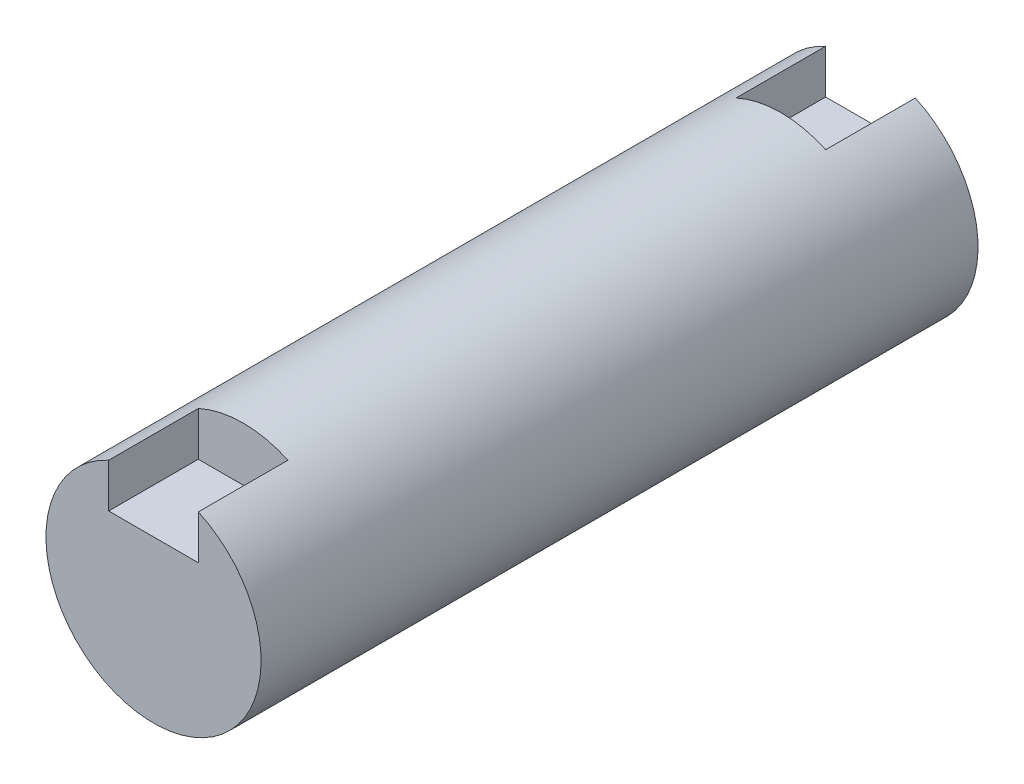
ISO-10303-21;
HEADER;
FILE_DESCRIPTION(('STEP AP214'),'2;1');
FILE_NAME('part.step','',(''),(''),'','','');
FILE_SCHEMA(('AUTOMOTIVE_DESIGN { 1 0 10303 214 1 1 1 1 }'));
ENDSEC;
DATA;
#1=APPLICATION_CONTEXT('core data for automotive mechanical design processes');
#2=APPLICATION_PROTOCOL_DEFINITION('international standard','automotive_design',2000,#1);
#3=PRODUCT_CONTEXT('',#1,'mechanical');
#4=PRODUCT('Part','Part','',(#3));
#5=PRODUCT_RELATED_PRODUCT_CATEGORY('part','',(#4));
#6=PRODUCT_DEFINITION_FORMATION('','',#4);
#7=PRODUCT_DEFINITION_CONTEXT('part definition',#1,'design');
#8=PRODUCT_DEFINITION('design','',#6,#7);
#9=PRODUCT_DEFINITION_SHAPE('','',#8);
#10=(LENGTH_UNIT() NAMED_UNIT(*) SI_UNIT(.MILLI.,.METRE.));
#11=(NAMED_UNIT(*) PLANE_ANGLE_UNIT() SI_UNIT($,.RADIAN.));
#12=(NAMED_UNIT(*) SI_UNIT($,.STERADIAN.) SOLID_ANGLE_UNIT());
#13=UNCERTAINTY_MEASURE_WITH_UNIT(LENGTH_MEASURE(1.E-05),#10,'distance_accuracy_value','');
#14=(GEOMETRIC_REPRESENTATION_CONTEXT(3) GLOBAL_UNCERTAINTY_ASSIGNED_CONTEXT((#13)) GLOBAL_UNIT_ASSIGNED_CONTEXT((#10,
#11,#12)) REPRESENTATION_CONTEXT('',''));
#15=CARTESIAN_POINT('',(0.,0.,0.));
#16=DIRECTION('',(0.,0.,1.));
#17=DIRECTION('',(1.,0.,0.));
#18=AXIS2_PLACEMENT_3D('',#15,#16,#17);
#19=CARTESIAN_POINT('',(0.,0.,40.));
#20=DIRECTION('',(0.,0.,-1.));
#21=DIRECTION('',(-1.,0.,0.));
#22=AXIS2_PLACEMENT_3D('',#19,#20,#21);
#23=CYLINDRICAL_SURFACE('',#22,6.);
#24=CARTESIAN_POINT('',(0.,0.,35.));
#25=DIRECTION('',(0.,0.,1.));
#26=DIRECTION('',(1.,0.,0.));
#27=AXIS2_PLACEMENT_3D('',#24,#25,#26);
#28=CIRCLE('',#27,6.);
#29=CARTESIAN_POINT('',(2.5,5.45435605731786,35.));
#30=VERTEX_POINT('',#29);
#31=CARTESIAN_POINT('',(-2.5,5.45435605731786,35.));
#32=VERTEX_POINT('',#31);
#33=EDGE_CURVE('E131',#30,#32,#28,.T.);
#34=ORIENTED_EDGE('',*,*,#33,.F.);
#35=DIRECTION('',(0.,0.,1.));
#36=VECTOR('',#35,1.);
#37=CARTESIAN_POINT('',(2.5,5.45435605731786,35.));
#38=LINE('',#37,#36);
#39=CARTESIAN_POINT('',(2.5,5.45435605731786,40.));
#40=VERTEX_POINT('',#39);
#41=EDGE_CURVE('E151',#30,#40,#38,.T.);
#42=ORIENTED_EDGE('',*,*,#41,.T.);
#43=CARTESIAN_POINT('',(0.,0.,40.));
#44=DIRECTION('',(0.,0.,1.));
#45=DIRECTION('',(1.,0.,0.));
#46=AXIS2_PLACEMENT_3D('',#43,#44,#45);
#47=CIRCLE('',#46,6.);
#48=CARTESIAN_POINT('',(-2.5,5.45435605731786,40.));
#49=VERTEX_POINT('',#48);
#50=EDGE_CURVE('E11',#49,#40,#47,.T.);
#51=ORIENTED_EDGE('',*,*,#50,.F.);
#52=DIRECTION('',(0.,0.,1.));
#53=VECTOR('',#52,1.);
#54=CARTESIAN_POINT('',(-2.5,5.45435605731786,35.));
#55=LINE('',#54,#53);
#56=EDGE_CURVE('E62',#32,#49,#55,.T.);
#57=ORIENTED_EDGE('',*,*,#56,.F.);
#58=EDGE_LOOP('',(#34,#42,#51,#57));
#59=FACE_BOUND('',#58,.T.);
#60=CARTESIAN_POINT('',(0.,0.,5.));
#61=DIRECTION('',(0.,0.,-1.));
#62=DIRECTION('',(-1.,0.,0.));
#63=AXIS2_PLACEMENT_3D('',#60,#61,#62);
#64=CIRCLE('',#63,6.);
#65=CARTESIAN_POINT('',(-2.5,5.45435605731786,5.));
#66=VERTEX_POINT('',#65);
#67=CARTESIAN_POINT('',(2.5,5.45435605731786,5.));
#68=VERTEX_POINT('',#67);
#69=EDGE_CURVE('E112',#66,#68,#64,.T.);
#70=ORIENTED_EDGE('',*,*,#69,.F.);
#71=DIRECTION('',(0.,0.,-1.));
#72=VECTOR('',#71,1.);
#73=CARTESIAN_POINT('',(-2.5,5.45435605731786,5.));
#74=LINE('',#73,#72);
#75=CARTESIAN_POINT('',(-2.5,5.45435605731786,0.));
#76=VERTEX_POINT('',#75);
#77=EDGE_CURVE('E147',#66,#76,#74,.T.);
#78=ORIENTED_EDGE('',*,*,#77,.T.);
#79=CARTESIAN_POINT('',(0.,0.,0.));
#80=DIRECTION('',(0.,0.,1.));
#81=DIRECTION('',(1.,0.,0.));
#82=AXIS2_PLACEMENT_3D('',#79,#80,#81);
#83=CIRCLE('',#82,6.);
#84=CARTESIAN_POINT('',(2.5,5.45435605731786,0.));
#85=VERTEX_POINT('',#84);
#86=EDGE_CURVE('E43',#76,#85,#83,.T.);
#87=ORIENTED_EDGE('',*,*,#86,.T.);
#88=DIRECTION('',(0.,0.,-1.));
#89=VECTOR('',#88,1.);
#90=CARTESIAN_POINT('',(2.5,5.45435605731786,5.));
#91=LINE('',#90,#89);
#92=EDGE_CURVE('E54',#68,#85,#91,.T.);
#93=ORIENTED_EDGE('',*,*,#92,.F.);
#94=EDGE_LOOP('',(#70,#78,#87,#93));
#95=FACE_BOUND('',#94,.T.);
#96=ADVANCED_FACE('F40',(#59,#95),#23,.T.);
#97=CARTESIAN_POINT('',(0.,0.,40.));
#98=DIRECTION('',(0.,0.,1.));
#99=DIRECTION('',(1.,0.,0.));
#100=AXIS2_PLACEMENT_3D('',#97,#98,#99);
#101=PLANE('',#100);
#102=DIRECTION('',(0.,1.,0.));
#103=VECTOR('',#102,1.);
#104=CARTESIAN_POINT('',(2.5,3.,40.));
#105=LINE('',#104,#103);
#106=CARTESIAN_POINT('',(2.5,3.,40.));
#107=VERTEX_POINT('',#106);
#108=EDGE_CURVE('E135',#107,#40,#105,.T.);
#109=ORIENTED_EDGE('',*,*,#108,.F.);
#110=DIRECTION('',(1.,0.,0.));
#111=VECTOR('',#110,1.);
#112=CARTESIAN_POINT('',(2.5,3.,40.));
#113=LINE('',#112,#111);
#114=CARTESIAN_POINT('',(-2.5,3.,40.));
#115=VERTEX_POINT('',#114);
#116=EDGE_CURVE('E146',#115,#107,#113,.T.);
#117=ORIENTED_EDGE('',*,*,#116,.F.);
#118=DIRECTION('',(0.,-1.,0.));
#119=VECTOR('',#118,1.);
#120=CARTESIAN_POINT('',(-2.5,3.,40.));
#121=LINE('',#120,#119);
#122=EDGE_CURVE('E144',#49,#115,#121,.T.);
#123=ORIENTED_EDGE('',*,*,#122,.F.);
#124=ORIENTED_EDGE('',*,*,#50,.T.);
#125=EDGE_LOOP('',(#109,#117,#123,#124));
#126=FACE_BOUND('',#125,.T.);
#127=ADVANCED_FACE('F166',(#126),#101,.T.);
#128=CARTESIAN_POINT('',(0.,0.,0.));
#129=DIRECTION('',(0.,0.,1.));
#130=DIRECTION('',(1.,0.,0.));
#131=AXIS2_PLACEMENT_3D('',#128,#129,#130);
#132=PLANE('',#131);
#133=ORIENTED_EDGE('',*,*,#86,.F.);
#134=DIRECTION('',(0.,1.,0.));
#135=VECTOR('',#134,1.);
#136=CARTESIAN_POINT('',(-2.5,3.,0.));
#137=LINE('',#136,#135);
#138=CARTESIAN_POINT('',(-2.5,3.,0.));
#139=VERTEX_POINT('',#138);
#140=EDGE_CURVE('E121',#139,#76,#137,.T.);
#141=ORIENTED_EDGE('',*,*,#140,.F.);
#142=DIRECTION('',(-1.,0.,0.));
#143=VECTOR('',#142,1.);
#144=CARTESIAN_POINT('',(-2.5,3.,0.));
#145=LINE('',#144,#143);
#146=CARTESIAN_POINT('',(2.5,3.,0.));
#147=VERTEX_POINT('',#146);
#148=EDGE_CURVE('E290',#147,#139,#145,.T.);
#149=ORIENTED_EDGE('',*,*,#148,.F.);
#150=DIRECTION('',(0.,-1.,0.));
#151=VECTOR('',#150,1.);
#152=CARTESIAN_POINT('',(2.5,3.,0.));
#153=LINE('',#152,#151);
#154=EDGE_CURVE('E292',#85,#147,#153,.T.);
#155=ORIENTED_EDGE('',*,*,#154,.F.);
#156=EDGE_LOOP('',(#133,#141,#149,#155));
#157=FACE_BOUND('',#156,.T.);
#158=ADVANCED_FACE('F191',(#157),#132,.F.);
#159=CARTESIAN_POINT('',(2.5,3.,35.));
#160=DIRECTION('',(1.,0.,0.));
#161=DIRECTION('',(0.,0.,-1.));
#162=AXIS2_PLACEMENT_3D('',#159,#160,#161);
#163=PLANE('',#162);
#164=ORIENTED_EDGE('',*,*,#108,.T.);
#165=ORIENTED_EDGE('',*,*,#41,.F.);
#166=DIRECTION('',(0.,1.,0.));
#167=VECTOR('',#166,1.);
#168=CARTESIAN_POINT('',(2.5,3.,35.));
#169=LINE('',#168,#167);
#170=CARTESIAN_POINT('',(2.5,3.,35.));
#171=VERTEX_POINT('',#170);
#172=EDGE_CURVE('E141',#171,#30,#169,.T.);
#173=ORIENTED_EDGE('',*,*,#172,.F.);
#174=DIRECTION('',(0.,0.,1.));
#175=VECTOR('',#174,1.);
#176=CARTESIAN_POINT('',(2.5,3.,35.));
#177=LINE('',#176,#175);
#178=EDGE_CURVE('E154',#171,#107,#177,.T.);
#179=ORIENTED_EDGE('',*,*,#178,.T.);
#180=EDGE_LOOP('',(#164,#165,#173,#179));
#181=FACE_BOUND('',#180,.T.);
#182=ADVANCED_FACE('F168',(#181),#163,.F.);
#183=CARTESIAN_POINT('',(2.5,3.,35.));
#184=DIRECTION('',(0.,-1.,0.));
#185=DIRECTION('',(0.,0.,-1.));
#186=AXIS2_PLACEMENT_3D('',#183,#184,#185);
#187=PLANE('',#186);
#188=ORIENTED_EDGE('',*,*,#116,.T.);
#189=ORIENTED_EDGE('',*,*,#178,.F.);
#190=DIRECTION('',(1.,0.,0.));
#191=VECTOR('',#190,1.);
#192=CARTESIAN_POINT('',(2.5,3.,35.));
#193=LINE('',#192,#191);
#194=CARTESIAN_POINT('',(-2.5,3.,35.));
#195=VERTEX_POINT('',#194);
#196=EDGE_CURVE('E138',#195,#171,#193,.T.);
#197=ORIENTED_EDGE('',*,*,#196,.F.);
#198=DIRECTION('',(0.,0.,1.));
#199=VECTOR('',#198,1.);
#200=CARTESIAN_POINT('',(-2.5,3.,35.));
#201=LINE('',#200,#199);
#202=EDGE_CURVE('E156',#195,#115,#201,.T.);
#203=ORIENTED_EDGE('',*,*,#202,.T.);
#204=EDGE_LOOP('',(#188,#189,#197,#203));
#205=FACE_BOUND('',#204,.T.);
#206=ADVANCED_FACE('F160',(#205),#187,.F.);
#207=CARTESIAN_POINT('',(-2.5,3.,35.));
#208=DIRECTION('',(-1.,0.,0.));
#209=DIRECTION('',(0.,0.,1.));
#210=AXIS2_PLACEMENT_3D('',#207,#208,#209);
#211=PLANE('',#210);
#212=ORIENTED_EDGE('',*,*,#122,.T.);
#213=ORIENTED_EDGE('',*,*,#202,.F.);
#214=DIRECTION('',(0.,-1.,0.));
#215=VECTOR('',#214,1.);
#216=CARTESIAN_POINT('',(-2.5,3.,35.));
#217=LINE('',#216,#215);
#218=EDGE_CURVE('E134',#32,#195,#217,.T.);
#219=ORIENTED_EDGE('',*,*,#218,.F.);
#220=ORIENTED_EDGE('',*,*,#56,.T.);
#221=EDGE_LOOP('',(#212,#213,#219,#220));
#222=FACE_BOUND('',#221,.T.);
#223=ADVANCED_FACE('F163',(#222),#211,.F.);
#224=CARTESIAN_POINT('',(0.,0.,35.));
#225=DIRECTION('',(0.,0.,1.));
#226=DIRECTION('',(1.,0.,0.));
#227=AXIS2_PLACEMENT_3D('',#224,#225,#226);
#228=PLANE('',#227);
#229=ORIENTED_EDGE('',*,*,#33,.T.);
#230=ORIENTED_EDGE('',*,*,#218,.T.);
#231=ORIENTED_EDGE('',*,*,#196,.T.);
#232=ORIENTED_EDGE('',*,*,#172,.T.);
#233=EDGE_LOOP('',(#229,#230,#231,#232));
#234=FACE_BOUND('',#233,.T.);
#235=ADVANCED_FACE('F173',(#234),#228,.T.);
#236=CARTESIAN_POINT('',(-2.5,3.,5.));
#237=DIRECTION('',(-1.,0.,0.));
#238=DIRECTION('',(0.,-1.,0.));
#239=AXIS2_PLACEMENT_3D('',#236,#237,#238);
#240=PLANE('',#239);
#241=ORIENTED_EDGE('',*,*,#140,.T.);
#242=ORIENTED_EDGE('',*,*,#77,.F.);
#243=DIRECTION('',(0.,1.,0.));
#244=VECTOR('',#243,1.);
#245=CARTESIAN_POINT('',(-2.5,3.,5.));
#246=LINE('',#245,#244);
#247=CARTESIAN_POINT('',(-2.5,3.,5.));
#248=VERTEX_POINT('',#247);
#249=EDGE_CURVE('E118',#248,#66,#246,.T.);
#250=ORIENTED_EDGE('',*,*,#249,.F.);
#251=DIRECTION('',(0.,0.,-1.));
#252=VECTOR('',#251,1.);
#253=CARTESIAN_POINT('',(-2.5,3.,5.));
#254=LINE('',#253,#252);
#255=EDGE_CURVE('E126',#248,#139,#254,.T.);
#256=ORIENTED_EDGE('',*,*,#255,.T.);
#257=EDGE_LOOP('',(#241,#242,#250,#256));
#258=FACE_BOUND('',#257,.T.);
#259=ADVANCED_FACE('F175',(#258),#240,.F.);
#260=CARTESIAN_POINT('',(-2.5,3.,5.));
#261=DIRECTION('',(0.,-1.,0.));
#262=DIRECTION('',(1.,0.,0.));
#263=AXIS2_PLACEMENT_3D('',#260,#261,#262);
#264=PLANE('',#263);
#265=ORIENTED_EDGE('',*,*,#148,.T.);
#266=ORIENTED_EDGE('',*,*,#255,.F.);
#267=DIRECTION('',(-1.,0.,0.));
#268=VECTOR('',#267,1.);
#269=CARTESIAN_POINT('',(-2.5,3.,5.));
#270=LINE('',#269,#268);
#271=CARTESIAN_POINT('',(2.5,3.,5.));
#272=VERTEX_POINT('',#271);
#273=EDGE_CURVE('E111',#272,#248,#270,.T.);
#274=ORIENTED_EDGE('',*,*,#273,.F.);
#275=DIRECTION('',(0.,0.,-1.));
#276=VECTOR('',#275,1.);
#277=CARTESIAN_POINT('',(2.5,3.,5.));
#278=LINE('',#277,#276);
#279=EDGE_CURVE('E107',#272,#147,#278,.T.);
#280=ORIENTED_EDGE('',*,*,#279,.T.);
#281=EDGE_LOOP('',(#265,#266,#274,#280));
#282=FACE_BOUND('',#281,.T.);
#283=ADVANCED_FACE('F181',(#282),#264,.F.);
#284=CARTESIAN_POINT('',(2.5,3.,5.));
#285=DIRECTION('',(1.,0.,0.));
#286=DIRECTION('',(0.,1.,0.));
#287=AXIS2_PLACEMENT_3D('',#284,#285,#286);
#288=PLANE('',#287);
#289=ORIENTED_EDGE('',*,*,#154,.T.);
#290=ORIENTED_EDGE('',*,*,#279,.F.);
#291=DIRECTION('',(0.,-1.,0.));
#292=VECTOR('',#291,1.);
#293=CARTESIAN_POINT('',(2.5,3.,5.));
#294=LINE('',#293,#292);
#295=EDGE_CURVE('E104',#68,#272,#294,.T.);
#296=ORIENTED_EDGE('',*,*,#295,.F.);
#297=ORIENTED_EDGE('',*,*,#92,.T.);
#298=EDGE_LOOP('',(#289,#290,#296,#297));
#299=FACE_BOUND('',#298,.T.);
#300=ADVANCED_FACE('F106',(#299),#288,.F.);
#301=CARTESIAN_POINT('',(0.,0.,5.));
#302=DIRECTION('',(0.,0.,-1.));
#303=DIRECTION('',(-1.,0.,0.));
#304=AXIS2_PLACEMENT_3D('',#301,#302,#303);
#305=PLANE('',#304);
#306=ORIENTED_EDGE('',*,*,#69,.T.);
#307=ORIENTED_EDGE('',*,*,#295,.T.);
#308=ORIENTED_EDGE('',*,*,#273,.T.);
#309=ORIENTED_EDGE('',*,*,#249,.T.);
#310=EDGE_LOOP('',(#306,#307,#308,#309));
#311=FACE_BOUND('',#310,.T.);
#312=ADVANCED_FACE('F116',(#311),#305,.T.);
#313=CLOSED_SHELL('',(#96,#127,#158,#182,#206,#223,#235,#259,#283,#300,#312));
#314=MANIFOLD_SOLID_BREP('B2',#313);
#315=ADVANCED_BREP_SHAPE_REPRESENTATION('',(#18,#314),#14);
#316=SHAPE_DEFINITION_REPRESENTATION(#9,#315);
ENDSEC;
END-ISO-10303-21;
